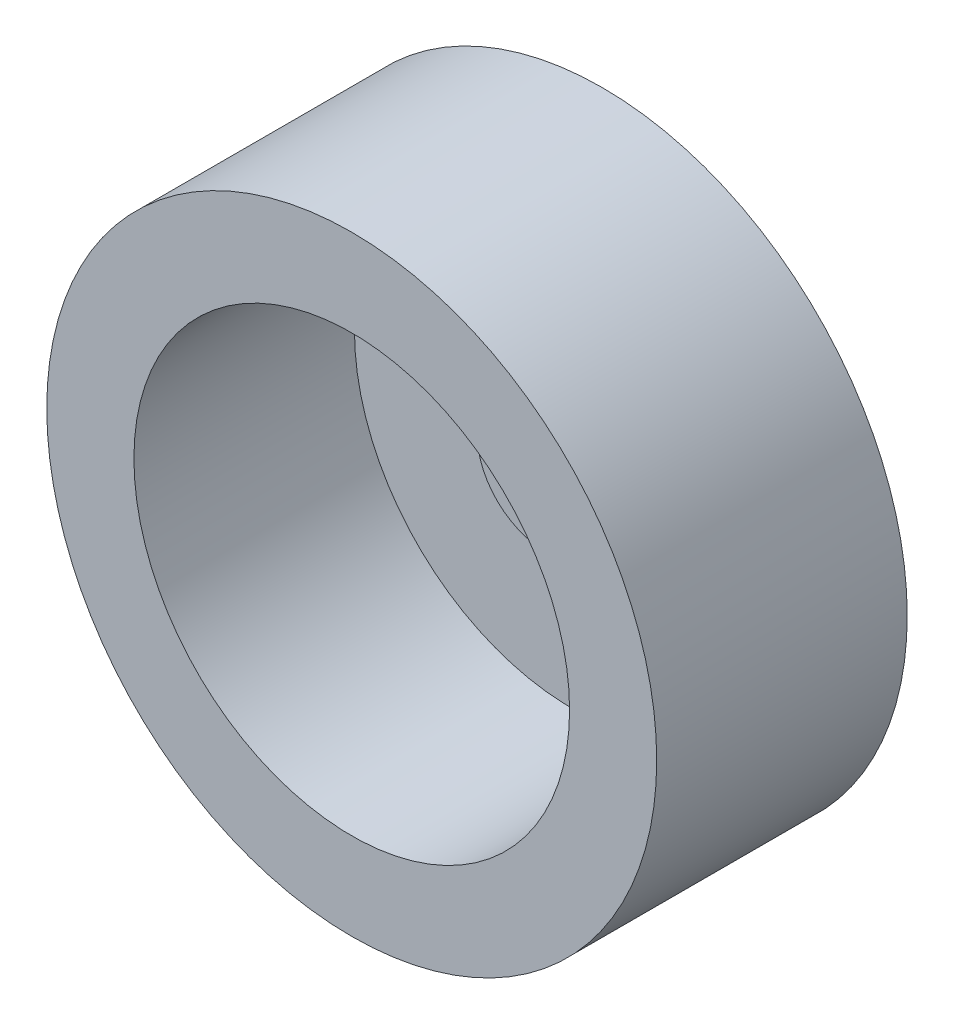
ISO-10303-21;
HEADER;
FILE_DESCRIPTION(('STEP AP214'),'2;1');
FILE_NAME('part.step','',(''),(''),'','','');
FILE_SCHEMA(('AUTOMOTIVE_DESIGN { 1 0 10303 214 1 1 1 1 }'));
ENDSEC;
DATA;
#1=APPLICATION_CONTEXT('core data for automotive mechanical design processes');
#2=APPLICATION_PROTOCOL_DEFINITION('international standard','automotive_design',2000,#1);
#3=PRODUCT_CONTEXT('',#1,'mechanical');
#4=PRODUCT('Part','Part','',(#3));
#5=PRODUCT_RELATED_PRODUCT_CATEGORY('part','',(#4));
#6=PRODUCT_DEFINITION_FORMATION('','',#4);
#7=PRODUCT_DEFINITION_CONTEXT('part definition',#1,'design');
#8=PRODUCT_DEFINITION('design','',#6,#7);
#9=PRODUCT_DEFINITION_SHAPE('','',#8);
#10=(LENGTH_UNIT() NAMED_UNIT(*) SI_UNIT(.MILLI.,.METRE.));
#11=(NAMED_UNIT(*) PLANE_ANGLE_UNIT() SI_UNIT($,.RADIAN.));
#12=(NAMED_UNIT(*) SI_UNIT($,.STERADIAN.) SOLID_ANGLE_UNIT());
#13=UNCERTAINTY_MEASURE_WITH_UNIT(LENGTH_MEASURE(1.E-05),#10,'distance_accuracy_value','');
#14=(GEOMETRIC_REPRESENTATION_CONTEXT(3) GLOBAL_UNCERTAINTY_ASSIGNED_CONTEXT((#13)) GLOBAL_UNIT_ASSIGNED_CONTEXT((#10,
#11,#12)) REPRESENTATION_CONTEXT('',''));
#15=CARTESIAN_POINT('',(0.,0.,0.));
#16=DIRECTION('',(0.,0.,1.));
#17=DIRECTION('',(1.,0.,0.));
#18=AXIS2_PLACEMENT_3D('',#15,#16,#17);
#19=CARTESIAN_POINT('',(0.,0.,-23.));
#20=DIRECTION('',(0.,0.,1.));
#21=DIRECTION('',(1.,0.,0.));
#22=AXIS2_PLACEMENT_3D('',#19,#20,#21);
#23=CYLINDRICAL_SURFACE('',#22,6.);
#24=CARTESIAN_POINT('',(0.,0.,-17.5));
#25=DIRECTION('',(0.,0.,1.));
#26=DIRECTION('',(1.,0.,0.));
#27=AXIS2_PLACEMENT_3D('',#24,#25,#26);
#28=CIRCLE('',#27,6.);
#29=CARTESIAN_POINT('',(6.,0.,-17.5));
#30=VERTEX_POINT('',#29);
#31=EDGE_CURVE('E145',#30,#30,#28,.T.);
#32=ORIENTED_EDGE('',*,*,#31,.T.);
#33=EDGE_LOOP('',(#32));
#34=FACE_BOUND('',#33,.T.);
#35=CARTESIAN_POINT('',(0.,0.,-20.));
#36=DIRECTION('',(0.,0.,-1.));
#37=DIRECTION('',(-1.,0.,0.));
#38=AXIS2_PLACEMENT_3D('',#35,#36,#37);
#39=CIRCLE('',#38,6.);
#40=CARTESIAN_POINT('',(-6.,0.,-20.));
#41=VERTEX_POINT('',#40);
#42=EDGE_CURVE('E47',#41,#41,#39,.F.);
#43=ORIENTED_EDGE('',*,*,#42,.F.);
#44=EDGE_LOOP('',(#43));
#45=FACE_BOUND('',#44,.T.);
#46=ADVANCED_FACE('F44',(#34,#45),#23,.F.);
#47=CARTESIAN_POINT('',(0.,0.,23.));
#48=DIRECTION('',(0.,0.,-1.));
#49=DIRECTION('',(-1.,0.,0.));
#50=AXIS2_PLACEMENT_3D('',#47,#48,#49);
#51=CYLINDRICAL_SURFACE('',#50,56.);
#52=CARTESIAN_POINT('',(0.,0.,23.));
#53=DIRECTION('',(0.,0.,1.));
#54=DIRECTION('',(1.,0.,0.));
#55=AXIS2_PLACEMENT_3D('',#52,#53,#54);
#56=CIRCLE('',#55,56.);
#57=CARTESIAN_POINT('',(56.,0.,23.));
#58=VERTEX_POINT('',#57);
#59=EDGE_CURVE('E11',#58,#58,#56,.T.);
#60=ORIENTED_EDGE('',*,*,#59,.F.);
#61=EDGE_LOOP('',(#60));
#62=FACE_BOUND('',#61,.T.);
#63=CARTESIAN_POINT('',(0.,0.,-23.));
#64=DIRECTION('',(0.,0.,1.));
#65=DIRECTION('',(1.,0.,0.));
#66=AXIS2_PLACEMENT_3D('',#63,#64,#65);
#67=CIRCLE('',#66,56.);
#68=CARTESIAN_POINT('',(56.,0.,-23.));
#69=VERTEX_POINT('',#68);
#70=EDGE_CURVE('E54',#69,#69,#67,.T.);
#71=ORIENTED_EDGE('',*,*,#70,.T.);
#72=EDGE_LOOP('',(#71));
#73=FACE_BOUND('',#72,.T.);
#74=ADVANCED_FACE('F50',(#62,#73),#51,.T.);
#75=CARTESIAN_POINT('',(0.,0.,23.));
#76=DIRECTION('',(0.,0.,1.));
#77=DIRECTION('',(1.,0.,0.));
#78=AXIS2_PLACEMENT_3D('',#75,#76,#77);
#79=PLANE('',#78);
#80=CARTESIAN_POINT('',(0.,0.,23.));
#81=DIRECTION('',(0.,0.,1.));
#82=DIRECTION('',(1.,0.,0.));
#83=AXIS2_PLACEMENT_3D('',#80,#81,#82);
#84=CIRCLE('',#83,40.);
#85=CARTESIAN_POINT('',(40.,0.,23.));
#86=VERTEX_POINT('',#85);
#87=EDGE_CURVE('E180',#86,#86,#84,.T.);
#88=ORIENTED_EDGE('',*,*,#87,.F.);
#89=EDGE_LOOP('',(#88));
#90=FACE_BOUND('',#89,.T.);
#91=ORIENTED_EDGE('',*,*,#59,.T.);
#92=EDGE_LOOP('',(#91));
#93=FACE_BOUND('',#92,.T.);
#94=ADVANCED_FACE('F194',(#90,#93),#79,.T.);
#95=CARTESIAN_POINT('',(0.,0.,-23.));
#96=DIRECTION('',(0.,0.,1.));
#97=DIRECTION('',(1.,0.,0.));
#98=AXIS2_PLACEMENT_3D('',#95,#96,#97);
#99=PLANE('',#98);
#100=CARTESIAN_POINT('',(0.,0.,-23.));
#101=DIRECTION('',(0.,0.,-1.));
#102=DIRECTION('',(-1.,0.,0.));
#103=AXIS2_PLACEMENT_3D('',#100,#101,#102);
#104=CIRCLE('',#103,12.5);
#105=CARTESIAN_POINT('',(-12.5,0.,-23.));
#106=VERTEX_POINT('',#105);
#107=EDGE_CURVE('E336',#106,#106,#104,.T.);
#108=ORIENTED_EDGE('',*,*,#107,.F.);
#109=EDGE_LOOP('',(#108));
#110=FACE_BOUND('',#109,.T.);
#111=ORIENTED_EDGE('',*,*,#70,.F.);
#112=EDGE_LOOP('',(#111));
#113=FACE_BOUND('',#112,.T.);
#114=ADVANCED_FACE('F195',(#110,#113),#99,.F.);
#115=CARTESIAN_POINT('',(0.,0.,-17.5));
#116=DIRECTION('',(0.,0.,1.));
#117=DIRECTION('',(1.,0.,0.));
#118=AXIS2_PLACEMENT_3D('',#115,#116,#117);
#119=CYLINDRICAL_SURFACE('',#118,40.);
#120=CARTESIAN_POINT('',(0.,0.,-17.5));
#121=DIRECTION('',(0.,0.,1.));
#122=DIRECTION('',(1.,0.,0.));
#123=AXIS2_PLACEMENT_3D('',#120,#121,#122);
#124=CIRCLE('',#123,40.);
#125=CARTESIAN_POINT('',(40.,0.,-17.5));
#126=VERTEX_POINT('',#125);
#127=EDGE_CURVE('E182',#126,#126,#124,.T.);
#128=ORIENTED_EDGE('',*,*,#127,.F.);
#129=EDGE_LOOP('',(#128));
#130=FACE_BOUND('',#129,.T.);
#131=ORIENTED_EDGE('',*,*,#87,.T.);
#132=EDGE_LOOP('',(#131));
#133=FACE_BOUND('',#132,.T.);
#134=ADVANCED_FACE('F193',(#130,#133),#119,.F.);
#135=CARTESIAN_POINT('',(0.,0.,-17.5));
#136=DIRECTION('',(0.,0.,1.));
#137=DIRECTION('',(1.,0.,0.));
#138=AXIS2_PLACEMENT_3D('',#135,#136,#137);
#139=PLANE('',#138);
#140=CARTESIAN_POINT('',(0.,0.,-17.5));
#141=DIRECTION('',(0.,0.,1.));
#142=DIRECTION('',(1.,0.,0.));
#143=AXIS2_PLACEMENT_3D('',#140,#141,#142);
#144=CIRCLE('',#143,12.5);
#145=CARTESIAN_POINT('',(12.5,0.,-17.5));
#146=VERTEX_POINT('',#145);
#147=EDGE_CURVE('E162',#146,#146,#144,.T.);
#148=ORIENTED_EDGE('',*,*,#147,.F.);
#149=EDGE_LOOP('',(#148));
#150=FACE_BOUND('',#149,.T.);
#151=ORIENTED_EDGE('',*,*,#127,.T.);
#152=EDGE_LOOP('',(#151));
#153=FACE_BOUND('',#152,.T.);
#154=ADVANCED_FACE('F205',(#150,#153),#139,.T.);
#155=CARTESIAN_POINT('',(0.,0.,-12.5));
#156=DIRECTION('',(0.,0.,-1.));
#157=DIRECTION('',(-1.,0.,0.));
#158=AXIS2_PLACEMENT_3D('',#155,#156,#157);
#159=CYLINDRICAL_SURFACE('',#158,12.5);
#160=CARTESIAN_POINT('',(0.,0.,-12.5));
#161=DIRECTION('',(0.,0.,1.));
#162=DIRECTION('',(1.,0.,0.));
#163=AXIS2_PLACEMENT_3D('',#160,#161,#162);
#164=CIRCLE('',#163,12.5);
#165=CARTESIAN_POINT('',(12.5,0.,-12.5));
#166=VERTEX_POINT('',#165);
#167=EDGE_CURVE('E171',#166,#166,#164,.T.);
#168=ORIENTED_EDGE('',*,*,#167,.F.);
#169=EDGE_LOOP('',(#168));
#170=FACE_BOUND('',#169,.T.);
#171=ORIENTED_EDGE('',*,*,#147,.T.);
#172=EDGE_LOOP('',(#171));
#173=FACE_BOUND('',#172,.T.);
#174=ADVANCED_FACE('F246',(#170,#173),#159,.T.);
#175=CARTESIAN_POINT('',(0.,0.,-12.5));
#176=DIRECTION('',(0.,0.,1.));
#177=DIRECTION('',(1.,0.,0.));
#178=AXIS2_PLACEMENT_3D('',#175,#176,#177);
#179=PLANE('',#178);
#180=DIRECTION('',(-0.866025403784438,0.5,0.));
#181=VECTOR('',#180,1.);
#182=CARTESIAN_POINT('',(8.5,4.90747728811182,-12.5));
#183=LINE('',#182,#181);
#184=CARTESIAN_POINT('',(8.5,4.90747728811182,-12.5));
#185=VERTEX_POINT('',#184);
#186=CARTESIAN_POINT('',(0.,9.81495457622365,-12.5));
#187=VERTEX_POINT('',#186);
#188=EDGE_CURVE('E61',#185,#187,#183,.T.);
#189=ORIENTED_EDGE('',*,*,#188,.F.);
#190=DIRECTION('',(0.,1.,0.));
#191=VECTOR('',#190,1.);
#192=CARTESIAN_POINT('',(8.50000000000001,-4.90747728811182,-12.5));
#193=LINE('',#192,#191);
#194=CARTESIAN_POINT('',(8.50000000000001,-4.90747728811182,-12.5));
#195=VERTEX_POINT('',#194);
#196=EDGE_CURVE('E160',#195,#185,#193,.T.);
#197=ORIENTED_EDGE('',*,*,#196,.F.);
#198=DIRECTION('',(0.866025403784439,0.5,0.));
#199=VECTOR('',#198,1.);
#200=CARTESIAN_POINT('',(0.,-9.81495457622364,-12.5));
#201=LINE('',#200,#199);
#202=CARTESIAN_POINT('',(0.,-9.81495457622364,-12.5));
#203=VERTEX_POINT('',#202);
#204=EDGE_CURVE('E152',#203,#195,#201,.T.);
#205=ORIENTED_EDGE('',*,*,#204,.F.);
#206=DIRECTION('',(0.866025403784439,-0.5,0.));
#207=VECTOR('',#206,1.);
#208=CARTESIAN_POINT('',(-8.5,-4.90747728811182,-12.5));
#209=LINE('',#208,#207);
#210=CARTESIAN_POINT('',(-8.5,-4.90747728811182,-12.5));
#211=VERTEX_POINT('',#210);
#212=EDGE_CURVE('E112',#211,#203,#209,.T.);
#213=ORIENTED_EDGE('',*,*,#212,.F.);
#214=DIRECTION('',(0.,-1.,0.));
#215=VECTOR('',#214,1.);
#216=CARTESIAN_POINT('',(-8.50000000000001,4.90747728811182,-12.5));
#217=LINE('',#216,#215);
#218=CARTESIAN_POINT('',(-8.50000000000001,4.90747728811182,-12.5));
#219=VERTEX_POINT('',#218);
#220=EDGE_CURVE('E146',#219,#211,#217,.T.);
#221=ORIENTED_EDGE('',*,*,#220,.F.);
#222=DIRECTION('',(-0.866025403784438,-0.5,0.));
#223=VECTOR('',#222,1.);
#224=CARTESIAN_POINT('',(0.,9.81495457622365,-12.5));
#225=LINE('',#224,#223);
#226=EDGE_CURVE('E141',#187,#219,#225,.T.);
#227=ORIENTED_EDGE('',*,*,#226,.F.);
#228=EDGE_LOOP('',(#189,#197,#205,#213,#221,#227));
#229=FACE_BOUND('',#228,.T.);
#230=ORIENTED_EDGE('',*,*,#167,.T.);
#231=EDGE_LOOP('',(#230));
#232=FACE_BOUND('',#231,.T.);
#233=ADVANCED_FACE('F241',(#229,#232),#179,.T.);
#234=CARTESIAN_POINT('',(8.5,4.90747728811182,-17.5));
#235=DIRECTION('',(0.5,0.866025403784439,0.));
#236=DIRECTION('',(-0.866025403784439,0.5,0.));
#237=AXIS2_PLACEMENT_3D('',#234,#235,#236);
#238=PLANE('',#237);
#239=ORIENTED_EDGE('',*,*,#188,.T.);
#240=DIRECTION('',(0.,0.,1.));
#241=VECTOR('',#240,1.);
#242=CARTESIAN_POINT('',(0.,9.81495457622365,-17.5));
#243=LINE('',#242,#241);
#244=CARTESIAN_POINT('',(0.,9.81495457622365,-17.5));
#245=VERTEX_POINT('',#244);
#246=EDGE_CURVE('E91',#245,#187,#243,.T.);
#247=ORIENTED_EDGE('',*,*,#246,.F.);
#248=DIRECTION('',(-0.866025403784438,0.5,0.));
#249=VECTOR('',#248,1.);
#250=CARTESIAN_POINT('',(8.5,4.90747728811182,-17.5));
#251=LINE('',#250,#249);
#252=CARTESIAN_POINT('',(8.5,4.90747728811182,-17.5));
#253=VERTEX_POINT('',#252);
#254=EDGE_CURVE('E159',#253,#245,#251,.T.);
#255=ORIENTED_EDGE('',*,*,#254,.F.);
#256=DIRECTION('',(0.,0.,1.));
#257=VECTOR('',#256,1.);
#258=CARTESIAN_POINT('',(8.5,4.90747728811182,-17.5));
#259=LINE('',#258,#257);
#260=EDGE_CURVE('E72',#253,#185,#259,.T.);
#261=ORIENTED_EDGE('',*,*,#260,.T.);
#262=EDGE_LOOP('',(#239,#247,#255,#261));
#263=FACE_BOUND('',#262,.T.);
#264=ADVANCED_FACE('F229',(#263),#238,.F.);
#265=CARTESIAN_POINT('',(8.50000000000001,-4.90747728811182,-17.5));
#266=DIRECTION('',(1.,0.,0.));
#267=DIRECTION('',(0.,1.,0.));
#268=AXIS2_PLACEMENT_3D('',#265,#266,#267);
#269=PLANE('',#268);
#270=ORIENTED_EDGE('',*,*,#196,.T.);
#271=ORIENTED_EDGE('',*,*,#260,.F.);
#272=DIRECTION('',(0.,1.,0.));
#273=VECTOR('',#272,1.);
#274=CARTESIAN_POINT('',(8.50000000000001,-4.90747728811182,-17.5));
#275=LINE('',#274,#273);
#276=CARTESIAN_POINT('',(8.50000000000001,-4.90747728811182,-17.5));
#277=VERTEX_POINT('',#276);
#278=EDGE_CURVE('E124',#277,#253,#275,.T.);
#279=ORIENTED_EDGE('',*,*,#278,.F.);
#280=DIRECTION('',(0.,0.,1.));
#281=VECTOR('',#280,1.);
#282=CARTESIAN_POINT('',(8.50000000000001,-4.90747728811182,-17.5));
#283=LINE('',#282,#281);
#284=EDGE_CURVE('E118',#277,#195,#283,.T.);
#285=ORIENTED_EDGE('',*,*,#284,.T.);
#286=EDGE_LOOP('',(#270,#271,#279,#285));
#287=FACE_BOUND('',#286,.T.);
#288=ADVANCED_FACE('F228',(#287),#269,.F.);
#289=CARTESIAN_POINT('',(0.,-9.81495457622364,-17.5));
#290=DIRECTION('',(0.5,-0.866025403784439,0.));
#291=DIRECTION('',(0.866025403784439,0.5,0.));
#292=AXIS2_PLACEMENT_3D('',#289,#290,#291);
#293=PLANE('',#292);
#294=ORIENTED_EDGE('',*,*,#204,.T.);
#295=ORIENTED_EDGE('',*,*,#284,.F.);
#296=DIRECTION('',(0.866025403784439,0.5,0.));
#297=VECTOR('',#296,1.);
#298=CARTESIAN_POINT('',(0.,-9.81495457622364,-17.5));
#299=LINE('',#298,#297);
#300=CARTESIAN_POINT('',(0.,-9.81495457622364,-17.5));
#301=VERTEX_POINT('',#300);
#302=EDGE_CURVE('E117',#301,#277,#299,.T.);
#303=ORIENTED_EDGE('',*,*,#302,.F.);
#304=DIRECTION('',(0.,0.,1.));
#305=VECTOR('',#304,1.);
#306=CARTESIAN_POINT('',(0.,-9.81495457622364,-17.5));
#307=LINE('',#306,#305);
#308=EDGE_CURVE('E102',#301,#203,#307,.T.);
#309=ORIENTED_EDGE('',*,*,#308,.T.);
#310=EDGE_LOOP('',(#294,#295,#303,#309));
#311=FACE_BOUND('',#310,.T.);
#312=ADVANCED_FACE('F121',(#311),#293,.F.);
#313=CARTESIAN_POINT('',(-8.5,-4.90747728811182,-17.5));
#314=DIRECTION('',(-0.5,-0.866025403784439,0.));
#315=DIRECTION('',(0.866025403784439,-0.5,0.));
#316=AXIS2_PLACEMENT_3D('',#313,#314,#315);
#317=PLANE('',#316);
#318=ORIENTED_EDGE('',*,*,#212,.T.);
#319=ORIENTED_EDGE('',*,*,#308,.F.);
#320=DIRECTION('',(0.866025403784439,-0.5,0.));
#321=VECTOR('',#320,1.);
#322=CARTESIAN_POINT('',(-8.5,-4.90747728811182,-17.5));
#323=LINE('',#322,#321);
#324=CARTESIAN_POINT('',(-8.5,-4.90747728811182,-17.5));
#325=VERTEX_POINT('',#324);
#326=EDGE_CURVE('E107',#325,#301,#323,.T.);
#327=ORIENTED_EDGE('',*,*,#326,.F.);
#328=DIRECTION('',(0.,0.,1.));
#329=VECTOR('',#328,1.);
#330=CARTESIAN_POINT('',(-8.5,-4.90747728811182,-17.5));
#331=LINE('',#330,#329);
#332=EDGE_CURVE('E120',#325,#211,#331,.T.);
#333=ORIENTED_EDGE('',*,*,#332,.T.);
#334=EDGE_LOOP('',(#318,#319,#327,#333));
#335=FACE_BOUND('',#334,.T.);
#336=ADVANCED_FACE('F106',(#335),#317,.F.);
#337=CARTESIAN_POINT('',(-8.50000000000001,4.90747728811182,-17.5));
#338=DIRECTION('',(-1.,0.,0.));
#339=DIRECTION('',(0.,-1.,0.));
#340=AXIS2_PLACEMENT_3D('',#337,#338,#339);
#341=PLANE('',#340);
#342=ORIENTED_EDGE('',*,*,#220,.T.);
#343=ORIENTED_EDGE('',*,*,#332,.F.);
#344=DIRECTION('',(0.,-1.,0.));
#345=VECTOR('',#344,1.);
#346=CARTESIAN_POINT('',(-8.50000000000001,4.90747728811182,-17.5));
#347=LINE('',#346,#345);
#348=CARTESIAN_POINT('',(-8.50000000000001,4.90747728811182,-17.5));
#349=VERTEX_POINT('',#348);
#350=EDGE_CURVE('E133',#349,#325,#347,.T.);
#351=ORIENTED_EDGE('',*,*,#350,.F.);
#352=DIRECTION('',(0.,0.,1.));
#353=VECTOR('',#352,1.);
#354=CARTESIAN_POINT('',(-8.50000000000001,4.90747728811182,-17.5));
#355=LINE('',#354,#353);
#356=EDGE_CURVE('E169',#349,#219,#355,.T.);
#357=ORIENTED_EDGE('',*,*,#356,.T.);
#358=EDGE_LOOP('',(#342,#343,#351,#357));
#359=FACE_BOUND('',#358,.T.);
#360=ADVANCED_FACE('F233',(#359),#341,.F.);
#361=CARTESIAN_POINT('',(0.,9.81495457622365,-17.5));
#362=DIRECTION('',(-0.5,0.866025403784438,0.));
#363=DIRECTION('',(-0.866025403784439,-0.5,0.));
#364=AXIS2_PLACEMENT_3D('',#361,#362,#363);
#365=PLANE('',#364);
#366=ORIENTED_EDGE('',*,*,#226,.T.);
#367=ORIENTED_EDGE('',*,*,#356,.F.);
#368=DIRECTION('',(-0.866025403784438,-0.5,0.));
#369=VECTOR('',#368,1.);
#370=CARTESIAN_POINT('',(0.,9.81495457622365,-17.5));
#371=LINE('',#370,#369);
#372=EDGE_CURVE('E132',#245,#349,#371,.T.);
#373=ORIENTED_EDGE('',*,*,#372,.F.);
#374=ORIENTED_EDGE('',*,*,#246,.T.);
#375=EDGE_LOOP('',(#366,#367,#373,#374));
#376=FACE_BOUND('',#375,.T.);
#377=ADVANCED_FACE('F221',(#376),#365,.F.);
#378=CARTESIAN_POINT('',(0.,0.,-17.5));
#379=DIRECTION('',(0.,0.,1.));
#380=DIRECTION('',(1.,0.,0.));
#381=AXIS2_PLACEMENT_3D('',#378,#379,#380);
#382=PLANE('',#381);
#383=ORIENTED_EDGE('',*,*,#31,.F.);
#384=EDGE_LOOP('',(#383));
#385=FACE_BOUND('',#384,.T.);
#386=ORIENTED_EDGE('',*,*,#254,.T.);
#387=ORIENTED_EDGE('',*,*,#372,.T.);
#388=ORIENTED_EDGE('',*,*,#350,.T.);
#389=ORIENTED_EDGE('',*,*,#326,.T.);
#390=ORIENTED_EDGE('',*,*,#302,.T.);
#391=ORIENTED_EDGE('',*,*,#278,.T.);
#392=EDGE_LOOP('',(#386,#387,#388,#389,#390,#391));
#393=FACE_BOUND('',#392,.T.);
#394=ADVANCED_FACE('F126',(#385,#393),#382,.T.);
#395=CARTESIAN_POINT('',(0.,0.,-20.));
#396=DIRECTION('',(0.,0.,-1.));
#397=DIRECTION('',(-1.,0.,0.));
#398=AXIS2_PLACEMENT_3D('',#395,#396,#397);
#399=PLANE('',#398);
#400=CARTESIAN_POINT('',(0.,0.,-20.));
#401=DIRECTION('',(0.,0.,-1.));
#402=DIRECTION('',(-1.,0.,0.));
#403=AXIS2_PLACEMENT_3D('',#400,#401,#402);
#404=CIRCLE('',#403,12.5);
#405=CARTESIAN_POINT('',(-12.5,0.,-20.));
#406=VERTEX_POINT('',#405);
#407=EDGE_CURVE('E338',#406,#406,#404,.T.);
#408=ORIENTED_EDGE('',*,*,#407,.T.);
#409=EDGE_LOOP('',(#408));
#410=FACE_BOUND('',#409,.T.);
#411=ORIENTED_EDGE('',*,*,#42,.T.);
#412=EDGE_LOOP('',(#411));
#413=FACE_BOUND('',#412,.T.);
#414=ADVANCED_FACE('F224',(#410,#413),#399,.T.);
#415=CARTESIAN_POINT('',(0.,0.,-20.));
#416=DIRECTION('',(0.,0.,-1.));
#417=DIRECTION('',(-1.,0.,0.));
#418=AXIS2_PLACEMENT_3D('',#415,#416,#417);
#419=CYLINDRICAL_SURFACE('',#418,12.5);
#420=ORIENTED_EDGE('',*,*,#407,.F.);
#421=EDGE_LOOP('',(#420));
#422=FACE_BOUND('',#421,.T.);
#423=ORIENTED_EDGE('',*,*,#107,.T.);
#424=EDGE_LOOP('',(#423));
#425=FACE_BOUND('',#424,.T.);
#426=ADVANCED_FACE('F219',(#422,#425),#419,.F.);
#427=CLOSED_SHELL('',(#46,#74,#94,#114,#134,#154,#174,#233,#264,#288,#312,#336,#360,#377,#394,
#414,#426));
#428=MANIFOLD_SOLID_BREP('B2',#427);
#429=ADVANCED_BREP_SHAPE_REPRESENTATION('',(#18,#428),#14);
#430=SHAPE_DEFINITION_REPRESENTATION(#9,#429);
ENDSEC;
END-ISO-10303-21;
